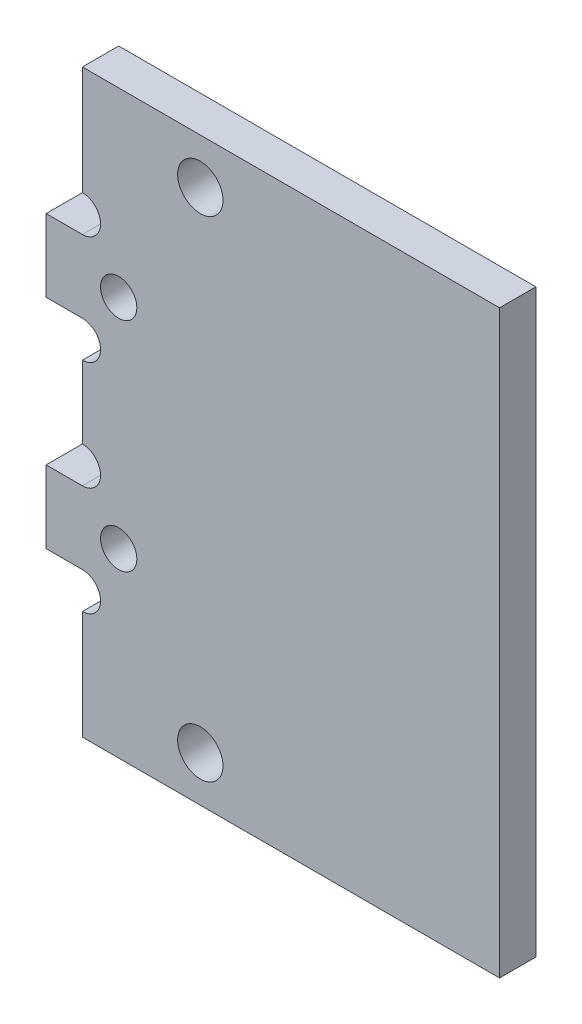
ISO-10303-21;
HEADER;
FILE_DESCRIPTION(('STEP AP214'),'2;1');
FILE_NAME('part.step','',(''),(''),'','','');
FILE_SCHEMA(('AUTOMOTIVE_DESIGN { 1 0 10303 214 1 1 1 1 }'));
ENDSEC;
DATA;
#1=APPLICATION_CONTEXT('core data for automotive mechanical design processes');
#2=APPLICATION_PROTOCOL_DEFINITION('international standard','automotive_design',2000,#1);
#3=PRODUCT_CONTEXT('',#1,'mechanical');
#4=PRODUCT('Part','Part','',(#3));
#5=PRODUCT_RELATED_PRODUCT_CATEGORY('part','',(#4));
#6=PRODUCT_DEFINITION_FORMATION('','',#4);
#7=PRODUCT_DEFINITION_CONTEXT('part definition',#1,'design');
#8=PRODUCT_DEFINITION('design','',#6,#7);
#9=PRODUCT_DEFINITION_SHAPE('','',#8);
#10=(LENGTH_UNIT() NAMED_UNIT(*) SI_UNIT(.MILLI.,.METRE.));
#11=(NAMED_UNIT(*) PLANE_ANGLE_UNIT() SI_UNIT($,.RADIAN.));
#12=(NAMED_UNIT(*) SI_UNIT($,.STERADIAN.) SOLID_ANGLE_UNIT());
#13=UNCERTAINTY_MEASURE_WITH_UNIT(LENGTH_MEASURE(1.E-05),#10,'distance_accuracy_value','');
#14=(GEOMETRIC_REPRESENTATION_CONTEXT(3) GLOBAL_UNCERTAINTY_ASSIGNED_CONTEXT((#13)) GLOBAL_UNIT_ASSIGNED_CONTEXT((#10,
#11,#12)) REPRESENTATION_CONTEXT('',''));
#15=CARTESIAN_POINT('',(0.,0.,0.));
#16=DIRECTION('',(0.,0.,1.));
#17=DIRECTION('',(1.,0.,0.));
#18=AXIS2_PLACEMENT_3D('',#15,#16,#17);
#19=CARTESIAN_POINT('',(-25.7162131979419,3.1625,2.));
#20=DIRECTION('',(0.,0.,1.));
#21=DIRECTION('',(1.,0.,0.));
#22=AXIS2_PLACEMENT_3D('',#19,#20,#21);
#23=PLANE('',#22);
#24=DIRECTION('',(0.,1.,0.));
#25=VECTOR('',#24,1.);
#26=CARTESIAN_POINT('',(-2.71621319794187,5.1625,2.));
#27=LINE('',#26,#25);
#28=CARTESIAN_POINT('',(-2.71621319794187,-21.8375,2.));
#29=VERTEX_POINT('',#28);
#30=CARTESIAN_POINT('',(-2.71621319794187,10.1625,2.));
#31=VERTEX_POINT('',#30);
#32=EDGE_CURVE('E290',#29,#31,#27,.T.);
#33=ORIENTED_EDGE('',*,*,#32,.T.);
#34=DIRECTION('',(-1.,0.,0.));
#35=VECTOR('',#34,1.);
#36=CARTESIAN_POINT('',(-17.2162131979419,10.1625,2.));
#37=LINE('',#36,#35);
#38=CARTESIAN_POINT('',(-25.7162131979419,10.1625,2.));
#39=VERTEX_POINT('',#38);
#40=EDGE_CURVE('E113',#31,#39,#37,.T.);
#41=ORIENTED_EDGE('',*,*,#40,.T.);
#42=DIRECTION('',(0.,-1.,0.));
#43=VECTOR('',#42,1.);
#44=CARTESIAN_POINT('',(-25.7162131979419,10.1625,2.));
#45=LINE('',#44,#43);
#46=CARTESIAN_POINT('',(-25.7162131979419,4.1625,2.));
#47=VERTEX_POINT('',#46);
#48=EDGE_CURVE('E332',#39,#47,#45,.T.);
#49=ORIENTED_EDGE('',*,*,#48,.T.);
#50=CARTESIAN_POINT('',(-25.7162131979419,3.1625,2.));
#51=DIRECTION('',(0.,0.,-1.));
#52=DIRECTION('',(1.,0.,0.));
#53=AXIS2_PLACEMENT_3D('',#50,#51,#52);
#54=CIRCLE('',#53,1.);
#55=CARTESIAN_POINT('',(-25.7162131979419,2.1625,2.));
#56=VERTEX_POINT('',#55);
#57=EDGE_CURVE('E235',#47,#56,#54,.T.);
#58=ORIENTED_EDGE('',*,*,#57,.T.);
#59=DIRECTION('',(-1.,0.,0.));
#60=VECTOR('',#59,1.);
#61=CARTESIAN_POINT('',(-25.7162131979419,2.1625,2.));
#62=LINE('',#61,#60);
#63=CARTESIAN_POINT('',(-27.7162131979419,2.1625,2.));
#64=VERTEX_POINT('',#63);
#65=EDGE_CURVE('E256',#56,#64,#62,.T.);
#66=ORIENTED_EDGE('',*,*,#65,.T.);
#67=DIRECTION('',(0.,-1.,0.));
#68=VECTOR('',#67,1.);
#69=CARTESIAN_POINT('',(-27.7162131979419,2.1625,2.));
#70=LINE('',#69,#68);
#71=CARTESIAN_POINT('',(-27.7162131979419,-1.8375,2.));
#72=VERTEX_POINT('',#71);
#73=EDGE_CURVE('E253',#64,#72,#70,.T.);
#74=ORIENTED_EDGE('',*,*,#73,.T.);
#75=DIRECTION('',(1.,0.,0.));
#76=VECTOR('',#75,1.);
#77=CARTESIAN_POINT('',(-27.7162131979419,-1.8375,2.));
#78=LINE('',#77,#76);
#79=CARTESIAN_POINT('',(-25.7162131979419,-1.8375,2.));
#80=VERTEX_POINT('',#79);
#81=EDGE_CURVE('E255',#72,#80,#78,.T.);
#82=ORIENTED_EDGE('',*,*,#81,.T.);
#83=CARTESIAN_POINT('',(-25.7162131979419,-2.8375,2.));
#84=DIRECTION('',(0.,0.,-1.));
#85=DIRECTION('',(-1.,0.,0.));
#86=AXIS2_PLACEMENT_3D('',#83,#84,#85);
#87=CIRCLE('',#86,1.);
#88=CARTESIAN_POINT('',(-25.7162131979419,-3.8375,2.));
#89=VERTEX_POINT('',#88);
#90=EDGE_CURVE('E258',#80,#89,#87,.T.);
#91=ORIENTED_EDGE('',*,*,#90,.T.);
#92=DIRECTION('',(0.,-1.,0.));
#93=VECTOR('',#92,1.);
#94=CARTESIAN_POINT('',(-25.7162131979419,-3.8375,2.));
#95=LINE('',#94,#93);
#96=CARTESIAN_POINT('',(-25.7162131979419,-7.8375,2.));
#97=VERTEX_POINT('',#96);
#98=EDGE_CURVE('E264',#89,#97,#95,.T.);
#99=ORIENTED_EDGE('',*,*,#98,.T.);
#100=CARTESIAN_POINT('',(-25.7162131979419,-8.8375,2.));
#101=DIRECTION('',(0.,0.,-1.));
#102=DIRECTION('',(1.,0.,0.));
#103=AXIS2_PLACEMENT_3D('',#100,#101,#102);
#104=CIRCLE('',#103,1.);
#105=CARTESIAN_POINT('',(-25.7162131979419,-9.8375,2.));
#106=VERTEX_POINT('',#105);
#107=EDGE_CURVE('E266',#97,#106,#104,.T.);
#108=ORIENTED_EDGE('',*,*,#107,.T.);
#109=DIRECTION('',(-1.,0.,0.));
#110=VECTOR('',#109,1.);
#111=CARTESIAN_POINT('',(-27.7162131979419,-9.8375,2.));
#112=LINE('',#111,#110);
#113=CARTESIAN_POINT('',(-27.7162131979419,-9.8375,2.));
#114=VERTEX_POINT('',#113);
#115=EDGE_CURVE('E268',#106,#114,#112,.T.);
#116=ORIENTED_EDGE('',*,*,#115,.T.);
#117=DIRECTION('',(0.,-1.,0.));
#118=VECTOR('',#117,1.);
#119=CARTESIAN_POINT('',(-27.7162131979419,-13.8375,2.));
#120=LINE('',#119,#118);
#121=CARTESIAN_POINT('',(-27.7162131979419,-13.8375,2.));
#122=VERTEX_POINT('',#121);
#123=EDGE_CURVE('E153',#114,#122,#120,.T.);
#124=ORIENTED_EDGE('',*,*,#123,.T.);
#125=DIRECTION('',(1.,0.,0.));
#126=VECTOR('',#125,1.);
#127=CARTESIAN_POINT('',(-25.7162131979419,-13.8375,2.));
#128=LINE('',#127,#126);
#129=CARTESIAN_POINT('',(-25.7162131979419,-13.8375,2.));
#130=VERTEX_POINT('',#129);
#131=EDGE_CURVE('E147',#122,#130,#128,.T.);
#132=ORIENTED_EDGE('',*,*,#131,.T.);
#133=CARTESIAN_POINT('',(-25.7162131979419,-14.8375,2.));
#134=DIRECTION('',(0.,0.,-1.));
#135=DIRECTION('',(-1.,0.,0.));
#136=AXIS2_PLACEMENT_3D('',#133,#134,#135);
#137=CIRCLE('',#136,0.999999999999999);
#138=CARTESIAN_POINT('',(-25.7162131979419,-15.8375,2.));
#139=VERTEX_POINT('',#138);
#140=EDGE_CURVE('E151',#130,#139,#137,.T.);
#141=ORIENTED_EDGE('',*,*,#140,.T.);
#142=DIRECTION('',(0.,-1.,0.));
#143=VECTOR('',#142,1.);
#144=CARTESIAN_POINT('',(-25.7162131979419,-15.8375,2.));
#145=LINE('',#144,#143);
#146=CARTESIAN_POINT('',(-25.7162131979419,-21.8375,2.));
#147=VERTEX_POINT('',#146);
#148=EDGE_CURVE('E49',#139,#147,#145,.T.);
#149=ORIENTED_EDGE('',*,*,#148,.T.);
#150=DIRECTION('',(1.,0.,0.));
#151=VECTOR('',#150,1.);
#152=CARTESIAN_POINT('',(-19.7162131979419,-21.8375,2.));
#153=LINE('',#152,#151);
#154=EDGE_CURVE('E167',#147,#29,#153,.T.);
#155=ORIENTED_EDGE('',*,*,#154,.T.);
#156=EDGE_LOOP('',(#33,#41,#49,#58,#66,#74,#82,#91,#99,#108,#116,#124,#132,#141,#149,#155));
#157=FACE_BOUND('',#156,.T.);
#158=CARTESIAN_POINT('',(-23.7162131979419,0.162500000000001,2.));
#159=DIRECTION('',(0.,0.,1.));
#160=DIRECTION('',(1.,0.,0.));
#161=AXIS2_PLACEMENT_3D('',#158,#159,#160);
#162=CIRCLE('',#161,1.);
#163=CARTESIAN_POINT('',(-22.7162131979419,0.162500000000001,2.));
#164=VERTEX_POINT('',#163);
#165=EDGE_CURVE('E315',#164,#164,#162,.T.);
#166=ORIENTED_EDGE('',*,*,#165,.F.);
#167=EDGE_LOOP('',(#166));
#168=FACE_BOUND('',#167,.T.);
#169=CARTESIAN_POINT('',(-19.2162131979419,7.6625,2.));
#170=DIRECTION('',(0.,0.,1.));
#171=DIRECTION('',(1.,0.,0.));
#172=AXIS2_PLACEMENT_3D('',#169,#170,#171);
#173=CIRCLE('',#172,1.25);
#174=CARTESIAN_POINT('',(-17.9662131979419,7.6625,2.));
#175=VERTEX_POINT('',#174);
#176=EDGE_CURVE('E176',#175,#175,#173,.T.);
#177=ORIENTED_EDGE('',*,*,#176,.F.);
#178=EDGE_LOOP('',(#177));
#179=FACE_BOUND('',#178,.T.);
#180=CARTESIAN_POINT('',(-19.2162131979419,-19.3375,2.));
#181=DIRECTION('',(0.,0.,1.));
#182=DIRECTION('',(1.,0.,0.));
#183=AXIS2_PLACEMENT_3D('',#180,#181,#182);
#184=CIRCLE('',#183,1.25);
#185=CARTESIAN_POINT('',(-17.9662131979419,-19.3375,2.));
#186=VERTEX_POINT('',#185);
#187=EDGE_CURVE('E321',#186,#186,#184,.T.);
#188=ORIENTED_EDGE('',*,*,#187,.F.);
#189=EDGE_LOOP('',(#188));
#190=FACE_BOUND('',#189,.T.);
#191=CARTESIAN_POINT('',(-23.7162131979419,-11.8375,2.));
#192=DIRECTION('',(0.,0.,1.));
#193=DIRECTION('',(1.,0.,0.));
#194=AXIS2_PLACEMENT_3D('',#191,#192,#193);
#195=CIRCLE('',#194,1.);
#196=CARTESIAN_POINT('',(-22.7162131979419,-11.8375,2.));
#197=VERTEX_POINT('',#196);
#198=EDGE_CURVE('E309',#197,#197,#195,.T.);
#199=ORIENTED_EDGE('',*,*,#198,.F.);
#200=EDGE_LOOP('',(#199));
#201=FACE_BOUND('',#200,.T.);
#202=ADVANCED_FACE('F32',(#157,#168,#179,#190,#201),#23,.T.);
#203=CARTESIAN_POINT('',(-25.7162131979419,3.1625,0.));
#204=DIRECTION('',(0.,0.,1.));
#205=DIRECTION('',(1.,0.,0.));
#206=AXIS2_PLACEMENT_3D('',#203,#204,#205);
#207=PLANE('',#206);
#208=DIRECTION('',(-1.,0.,0.));
#209=VECTOR('',#208,1.);
#210=CARTESIAN_POINT('',(-17.2162131979419,10.1625,0.));
#211=LINE('',#210,#209);
#212=CARTESIAN_POINT('',(-2.71621319794187,10.1625,0.));
#213=VERTEX_POINT('',#212);
#214=CARTESIAN_POINT('',(-25.7162131979419,10.1625,0.));
#215=VERTEX_POINT('',#214);
#216=EDGE_CURVE('E199',#213,#215,#211,.T.);
#217=ORIENTED_EDGE('',*,*,#216,.F.);
#218=DIRECTION('',(0.,1.,0.));
#219=VECTOR('',#218,1.);
#220=CARTESIAN_POINT('',(-2.71621319794187,5.1625,0.));
#221=LINE('',#220,#219);
#222=CARTESIAN_POINT('',(-2.71621319794187,-21.8375,0.));
#223=VERTEX_POINT('',#222);
#224=EDGE_CURVE('E297',#223,#213,#221,.T.);
#225=ORIENTED_EDGE('',*,*,#224,.F.);
#226=DIRECTION('',(1.,0.,0.));
#227=VECTOR('',#226,1.);
#228=CARTESIAN_POINT('',(13.2837868020581,-21.8375,0.));
#229=LINE('',#228,#227);
#230=CARTESIAN_POINT('',(-25.7162131979419,-21.8375,0.));
#231=VERTEX_POINT('',#230);
#232=EDGE_CURVE('E105',#231,#223,#229,.T.);
#233=ORIENTED_EDGE('',*,*,#232,.F.);
#234=DIRECTION('',(0.,-1.,0.));
#235=VECTOR('',#234,1.);
#236=CARTESIAN_POINT('',(-25.7162131979419,-15.8375,0.));
#237=LINE('',#236,#235);
#238=CARTESIAN_POINT('',(-25.7162131979419,-15.8375,0.));
#239=VERTEX_POINT('',#238);
#240=EDGE_CURVE('E196',#239,#231,#237,.T.);
#241=ORIENTED_EDGE('',*,*,#240,.F.);
#242=CARTESIAN_POINT('',(-25.7162131979419,-14.8375,0.));
#243=DIRECTION('',(0.,0.,-1.));
#244=DIRECTION('',(-1.,0.,0.));
#245=AXIS2_PLACEMENT_3D('',#242,#243,#244);
#246=CIRCLE('',#245,0.999999999999999);
#247=CARTESIAN_POINT('',(-25.7162131979419,-13.8375,0.));
#248=VERTEX_POINT('',#247);
#249=EDGE_CURVE('E97',#248,#239,#246,.T.);
#250=ORIENTED_EDGE('',*,*,#249,.F.);
#251=DIRECTION('',(1.,0.,0.));
#252=VECTOR('',#251,1.);
#253=CARTESIAN_POINT('',(-25.7162131979419,-13.8375,0.));
#254=LINE('',#253,#252);
#255=CARTESIAN_POINT('',(-27.7162131979419,-13.8375,0.));
#256=VERTEX_POINT('',#255);
#257=EDGE_CURVE('E161',#256,#248,#254,.T.);
#258=ORIENTED_EDGE('',*,*,#257,.F.);
#259=DIRECTION('',(0.,-1.,0.));
#260=VECTOR('',#259,1.);
#261=CARTESIAN_POINT('',(-27.7162131979419,-13.8375,0.));
#262=LINE('',#261,#260);
#263=CARTESIAN_POINT('',(-27.7162131979419,-9.8375,0.));
#264=VERTEX_POINT('',#263);
#265=EDGE_CURVE('E192',#264,#256,#262,.T.);
#266=ORIENTED_EDGE('',*,*,#265,.F.);
#267=DIRECTION('',(-1.,0.,0.));
#268=VECTOR('',#267,1.);
#269=CARTESIAN_POINT('',(-27.7162131979419,-9.8375,0.));
#270=LINE('',#269,#268);
#271=CARTESIAN_POINT('',(-25.7162131979419,-9.8375,0.));
#272=VERTEX_POINT('',#271);
#273=EDGE_CURVE('E190',#272,#264,#270,.T.);
#274=ORIENTED_EDGE('',*,*,#273,.F.);
#275=CARTESIAN_POINT('',(-25.7162131979419,-8.8375,0.));
#276=DIRECTION('',(0.,0.,-1.));
#277=DIRECTION('',(1.,0.,0.));
#278=AXIS2_PLACEMENT_3D('',#275,#276,#277);
#279=CIRCLE('',#278,1.);
#280=CARTESIAN_POINT('',(-25.7162131979419,-7.8375,0.));
#281=VERTEX_POINT('',#280);
#282=EDGE_CURVE('E188',#281,#272,#279,.T.);
#283=ORIENTED_EDGE('',*,*,#282,.F.);
#284=DIRECTION('',(0.,-1.,0.));
#285=VECTOR('',#284,1.);
#286=CARTESIAN_POINT('',(-25.7162131979419,-3.8375,0.));
#287=LINE('',#286,#285);
#288=CARTESIAN_POINT('',(-25.7162131979419,-3.8375,0.));
#289=VERTEX_POINT('',#288);
#290=EDGE_CURVE('E186',#289,#281,#287,.T.);
#291=ORIENTED_EDGE('',*,*,#290,.F.);
#292=CARTESIAN_POINT('',(-25.7162131979419,-2.8375,0.));
#293=DIRECTION('',(0.,0.,-1.));
#294=DIRECTION('',(-1.,0.,0.));
#295=AXIS2_PLACEMENT_3D('',#292,#293,#294);
#296=CIRCLE('',#295,1.);
#297=CARTESIAN_POINT('',(-25.7162131979419,-1.8375,0.));
#298=VERTEX_POINT('',#297);
#299=EDGE_CURVE('E184',#298,#289,#296,.T.);
#300=ORIENTED_EDGE('',*,*,#299,.F.);
#301=DIRECTION('',(1.,0.,0.));
#302=VECTOR('',#301,1.);
#303=CARTESIAN_POINT('',(-27.7162131979419,-1.8375,0.));
#304=LINE('',#303,#302);
#305=CARTESIAN_POINT('',(-27.7162131979419,-1.8375,0.));
#306=VERTEX_POINT('',#305);
#307=EDGE_CURVE('E182',#306,#298,#304,.T.);
#308=ORIENTED_EDGE('',*,*,#307,.F.);
#309=DIRECTION('',(0.,-1.,0.));
#310=VECTOR('',#309,1.);
#311=CARTESIAN_POINT('',(-27.7162131979419,2.1625,0.));
#312=LINE('',#311,#310);
#313=CARTESIAN_POINT('',(-27.7162131979419,2.1625,0.));
#314=VERTEX_POINT('',#313);
#315=EDGE_CURVE('E180',#314,#306,#312,.T.);
#316=ORIENTED_EDGE('',*,*,#315,.F.);
#317=DIRECTION('',(-1.,0.,0.));
#318=VECTOR('',#317,1.);
#319=CARTESIAN_POINT('',(-25.7162131979419,2.1625,0.));
#320=LINE('',#319,#318);
#321=CARTESIAN_POINT('',(-25.7162131979419,2.1625,0.));
#322=VERTEX_POINT('',#321);
#323=EDGE_CURVE('E178',#322,#314,#320,.T.);
#324=ORIENTED_EDGE('',*,*,#323,.F.);
#325=CARTESIAN_POINT('',(-25.7162131979419,3.1625,0.));
#326=DIRECTION('',(0.,0.,-1.));
#327=DIRECTION('',(1.,0.,0.));
#328=AXIS2_PLACEMENT_3D('',#325,#326,#327);
#329=CIRCLE('',#328,1.);
#330=CARTESIAN_POINT('',(-25.7162131979419,4.1625,0.));
#331=VERTEX_POINT('',#330);
#332=EDGE_CURVE('E175',#331,#322,#329,.T.);
#333=ORIENTED_EDGE('',*,*,#332,.F.);
#334=DIRECTION('',(0.,-1.,0.));
#335=VECTOR('',#334,1.);
#336=CARTESIAN_POINT('',(-25.7162131979419,10.1625,0.));
#337=LINE('',#336,#335);
#338=EDGE_CURVE('E173',#215,#331,#337,.T.);
#339=ORIENTED_EDGE('',*,*,#338,.F.);
#340=EDGE_LOOP('',(#217,#225,#233,#241,#250,#258,#266,#274,#283,#291,#300,#308,#316,#324,#333,#339));
#341=FACE_BOUND('',#340,.T.);
#342=CARTESIAN_POINT('',(-19.2162131979419,7.6625,0.));
#343=DIRECTION('',(0.,0.,1.));
#344=DIRECTION('',(1.,0.,0.));
#345=AXIS2_PLACEMENT_3D('',#342,#343,#344);
#346=CIRCLE('',#345,1.25);
#347=CARTESIAN_POINT('',(-17.9662131979419,7.6625,0.));
#348=VERTEX_POINT('',#347);
#349=EDGE_CURVE('E324',#348,#348,#346,.T.);
#350=ORIENTED_EDGE('',*,*,#349,.T.);
#351=EDGE_LOOP('',(#350));
#352=FACE_BOUND('',#351,.T.);
#353=CARTESIAN_POINT('',(-19.2162131979419,-19.3375,0.));
#354=DIRECTION('',(0.,0.,1.));
#355=DIRECTION('',(1.,0.,0.));
#356=AXIS2_PLACEMENT_3D('',#353,#354,#355);
#357=CIRCLE('',#356,1.25);
#358=CARTESIAN_POINT('',(-17.9662131979419,-19.3375,0.));
#359=VERTEX_POINT('',#358);
#360=EDGE_CURVE('E318',#359,#359,#357,.T.);
#361=ORIENTED_EDGE('',*,*,#360,.T.);
#362=EDGE_LOOP('',(#361));
#363=FACE_BOUND('',#362,.T.);
#364=CARTESIAN_POINT('',(-23.7162131979419,0.162500000000001,0.));
#365=DIRECTION('',(0.,0.,1.));
#366=DIRECTION('',(1.,0.,0.));
#367=AXIS2_PLACEMENT_3D('',#364,#365,#366);
#368=CIRCLE('',#367,1.);
#369=CARTESIAN_POINT('',(-22.7162131979419,0.162500000000001,0.));
#370=VERTEX_POINT('',#369);
#371=EDGE_CURVE('E312',#370,#370,#368,.T.);
#372=ORIENTED_EDGE('',*,*,#371,.T.);
#373=EDGE_LOOP('',(#372));
#374=FACE_BOUND('',#373,.T.);
#375=CARTESIAN_POINT('',(-23.7162131979419,-11.8375,0.));
#376=DIRECTION('',(0.,0.,1.));
#377=DIRECTION('',(1.,0.,0.));
#378=AXIS2_PLACEMENT_3D('',#375,#376,#377);
#379=CIRCLE('',#378,1.);
#380=CARTESIAN_POINT('',(-22.7162131979419,-11.8375,0.));
#381=VERTEX_POINT('',#380);
#382=EDGE_CURVE('E307',#381,#381,#379,.T.);
#383=ORIENTED_EDGE('',*,*,#382,.T.);
#384=EDGE_LOOP('',(#383));
#385=FACE_BOUND('',#384,.T.);
#386=ADVANCED_FACE('F241',(#341,#352,#363,#374,#385),#207,.F.);
#387=CARTESIAN_POINT('',(-25.7162131979419,10.1625,2.));
#388=DIRECTION('',(1.,0.,0.));
#389=DIRECTION('',(0.,0.,-1.));
#390=AXIS2_PLACEMENT_3D('',#387,#388,#389);
#391=PLANE('',#390);
#392=ORIENTED_EDGE('',*,*,#338,.T.);
#393=DIRECTION('',(0.,0.,-1.));
#394=VECTOR('',#393,1.);
#395=CARTESIAN_POINT('',(-25.7162131979419,4.1625,2.));
#396=LINE('',#395,#394);
#397=EDGE_CURVE('E41',#47,#331,#396,.T.);
#398=ORIENTED_EDGE('',*,*,#397,.F.);
#399=ORIENTED_EDGE('',*,*,#48,.F.);
#400=DIRECTION('',(0.,0.,-1.));
#401=VECTOR('',#400,1.);
#402=CARTESIAN_POINT('',(-25.7162131979419,10.1625,2.));
#403=LINE('',#402,#401);
#404=EDGE_CURVE('E11',#39,#215,#403,.T.);
#405=ORIENTED_EDGE('',*,*,#404,.T.);
#406=EDGE_LOOP('',(#392,#398,#399,#405));
#407=FACE_BOUND('',#406,.T.);
#408=ADVANCED_FACE('F34',(#407),#391,.F.);
#409=CARTESIAN_POINT('',(-25.7162131979419,3.1625,2.));
#410=DIRECTION('',(0.,0.,-1.));
#411=DIRECTION('',(-1.,0.,0.));
#412=AXIS2_PLACEMENT_3D('',#409,#410,#411);
#413=CYLINDRICAL_SURFACE('',#412,1.);
#414=ORIENTED_EDGE('',*,*,#332,.T.);
#415=DIRECTION('',(0.,0.,-1.));
#416=VECTOR('',#415,1.);
#417=CARTESIAN_POINT('',(-25.7162131979419,2.1625,2.));
#418=LINE('',#417,#416);
#419=EDGE_CURVE('E226',#56,#322,#418,.T.);
#420=ORIENTED_EDGE('',*,*,#419,.F.);
#421=ORIENTED_EDGE('',*,*,#57,.F.);
#422=ORIENTED_EDGE('',*,*,#397,.T.);
#423=EDGE_LOOP('',(#414,#420,#421,#422));
#424=FACE_BOUND('',#423,.T.);
#425=ADVANCED_FACE('F233',(#424),#413,.F.);
#426=CARTESIAN_POINT('',(-25.7162131979419,2.1625,2.));
#427=DIRECTION('',(0.,-1.,0.));
#428=DIRECTION('',(1.,0.,0.));
#429=AXIS2_PLACEMENT_3D('',#426,#427,#428);
#430=PLANE('',#429);
#431=ORIENTED_EDGE('',*,*,#323,.T.);
#432=DIRECTION('',(0.,0.,-1.));
#433=VECTOR('',#432,1.);
#434=CARTESIAN_POINT('',(-27.7162131979419,2.1625,2.));
#435=LINE('',#434,#433);
#436=EDGE_CURVE('E223',#64,#314,#435,.T.);
#437=ORIENTED_EDGE('',*,*,#436,.F.);
#438=ORIENTED_EDGE('',*,*,#65,.F.);
#439=ORIENTED_EDGE('',*,*,#419,.T.);
#440=EDGE_LOOP('',(#431,#437,#438,#439));
#441=FACE_BOUND('',#440,.T.);
#442=ADVANCED_FACE('F247',(#441),#430,.F.);
#443=CARTESIAN_POINT('',(-27.7162131979419,2.1625,2.));
#444=DIRECTION('',(1.,0.,0.));
#445=DIRECTION('',(0.,0.,-1.));
#446=AXIS2_PLACEMENT_3D('',#443,#444,#445);
#447=PLANE('',#446);
#448=ORIENTED_EDGE('',*,*,#315,.T.);
#449=DIRECTION('',(0.,0.,-1.));
#450=VECTOR('',#449,1.);
#451=CARTESIAN_POINT('',(-27.7162131979419,-1.8375,2.));
#452=LINE('',#451,#450);
#453=EDGE_CURVE('E220',#72,#306,#452,.T.);
#454=ORIENTED_EDGE('',*,*,#453,.F.);
#455=ORIENTED_EDGE('',*,*,#73,.F.);
#456=ORIENTED_EDGE('',*,*,#436,.T.);
#457=EDGE_LOOP('',(#448,#454,#455,#456));
#458=FACE_BOUND('',#457,.T.);
#459=ADVANCED_FACE('F251',(#458),#447,.F.);
#460=CARTESIAN_POINT('',(-27.7162131979419,-1.8375,2.));
#461=DIRECTION('',(0.,1.,0.));
#462=DIRECTION('',(-1.,0.,0.));
#463=AXIS2_PLACEMENT_3D('',#460,#461,#462);
#464=PLANE('',#463);
#465=ORIENTED_EDGE('',*,*,#307,.T.);
#466=DIRECTION('',(0.,0.,-1.));
#467=VECTOR('',#466,1.);
#468=CARTESIAN_POINT('',(-25.7162131979419,-1.8375,2.));
#469=LINE('',#468,#467);
#470=EDGE_CURVE('E217',#80,#298,#469,.T.);
#471=ORIENTED_EDGE('',*,*,#470,.F.);
#472=ORIENTED_EDGE('',*,*,#81,.F.);
#473=ORIENTED_EDGE('',*,*,#453,.T.);
#474=EDGE_LOOP('',(#465,#471,#472,#473));
#475=FACE_BOUND('',#474,.T.);
#476=ADVANCED_FACE('F372',(#475),#464,.F.);
#477=CARTESIAN_POINT('',(-25.7162131979419,-2.8375,2.));
#478=DIRECTION('',(0.,0.,-1.));
#479=DIRECTION('',(-1.,0.,0.));
#480=AXIS2_PLACEMENT_3D('',#477,#478,#479);
#481=CYLINDRICAL_SURFACE('',#480,1.);
#482=ORIENTED_EDGE('',*,*,#299,.T.);
#483=DIRECTION('',(0.,0.,-1.));
#484=VECTOR('',#483,1.);
#485=CARTESIAN_POINT('',(-25.7162131979419,-3.8375,2.));
#486=LINE('',#485,#484);
#487=EDGE_CURVE('E214',#89,#289,#486,.T.);
#488=ORIENTED_EDGE('',*,*,#487,.F.);
#489=ORIENTED_EDGE('',*,*,#90,.F.);
#490=ORIENTED_EDGE('',*,*,#470,.T.);
#491=EDGE_LOOP('',(#482,#488,#489,#490));
#492=FACE_BOUND('',#491,.T.);
#493=ADVANCED_FACE('F368',(#492),#481,.F.);
#494=CARTESIAN_POINT('',(-25.7162131979419,-3.8375,2.));
#495=DIRECTION('',(1.,0.,0.));
#496=DIRECTION('',(0.,0.,-1.));
#497=AXIS2_PLACEMENT_3D('',#494,#495,#496);
#498=PLANE('',#497);
#499=ORIENTED_EDGE('',*,*,#290,.T.);
#500=DIRECTION('',(0.,0.,-1.));
#501=VECTOR('',#500,1.);
#502=CARTESIAN_POINT('',(-25.7162131979419,-7.8375,2.));
#503=LINE('',#502,#501);
#504=EDGE_CURVE('E211',#97,#281,#503,.T.);
#505=ORIENTED_EDGE('',*,*,#504,.F.);
#506=ORIENTED_EDGE('',*,*,#98,.F.);
#507=ORIENTED_EDGE('',*,*,#487,.T.);
#508=EDGE_LOOP('',(#499,#505,#506,#507));
#509=FACE_BOUND('',#508,.T.);
#510=ADVANCED_FACE('F364',(#509),#498,.F.);
#511=CARTESIAN_POINT('',(-25.7162131979419,-8.8375,2.));
#512=DIRECTION('',(0.,0.,-1.));
#513=DIRECTION('',(-1.,0.,0.));
#514=AXIS2_PLACEMENT_3D('',#511,#512,#513);
#515=CYLINDRICAL_SURFACE('',#514,1.);
#516=ORIENTED_EDGE('',*,*,#282,.T.);
#517=DIRECTION('',(0.,0.,-1.));
#518=VECTOR('',#517,1.);
#519=CARTESIAN_POINT('',(-25.7162131979419,-9.8375,2.));
#520=LINE('',#519,#518);
#521=EDGE_CURVE('E208',#106,#272,#520,.T.);
#522=ORIENTED_EDGE('',*,*,#521,.F.);
#523=ORIENTED_EDGE('',*,*,#107,.F.);
#524=ORIENTED_EDGE('',*,*,#504,.T.);
#525=EDGE_LOOP('',(#516,#522,#523,#524));
#526=FACE_BOUND('',#525,.T.);
#527=ADVANCED_FACE('F361',(#526),#515,.F.);
#528=CARTESIAN_POINT('',(-27.7162131979419,-9.8375,2.));
#529=DIRECTION('',(0.,-1.,0.));
#530=DIRECTION('',(0.,0.,-1.));
#531=AXIS2_PLACEMENT_3D('',#528,#529,#530);
#532=PLANE('',#531);
#533=ORIENTED_EDGE('',*,*,#273,.T.);
#534=DIRECTION('',(0.,0.,-1.));
#535=VECTOR('',#534,1.);
#536=CARTESIAN_POINT('',(-27.7162131979419,-9.8375,2.));
#537=LINE('',#536,#535);
#538=EDGE_CURVE('E205',#114,#264,#537,.T.);
#539=ORIENTED_EDGE('',*,*,#538,.F.);
#540=ORIENTED_EDGE('',*,*,#115,.F.);
#541=ORIENTED_EDGE('',*,*,#521,.T.);
#542=EDGE_LOOP('',(#533,#539,#540,#541));
#543=FACE_BOUND('',#542,.T.);
#544=ADVANCED_FACE('F274',(#543),#532,.F.);
#545=CARTESIAN_POINT('',(-27.7162131979419,-13.8375,2.));
#546=DIRECTION('',(1.,0.,0.));
#547=DIRECTION('',(0.,0.,-1.));
#548=AXIS2_PLACEMENT_3D('',#545,#546,#547);
#549=PLANE('',#548);
#550=ORIENTED_EDGE('',*,*,#265,.T.);
#551=DIRECTION('',(0.,0.,-1.));
#552=VECTOR('',#551,1.);
#553=CARTESIAN_POINT('',(-27.7162131979419,-13.8375,2.));
#554=LINE('',#553,#552);
#555=EDGE_CURVE('E162',#122,#256,#554,.T.);
#556=ORIENTED_EDGE('',*,*,#555,.F.);
#557=ORIENTED_EDGE('',*,*,#123,.F.);
#558=ORIENTED_EDGE('',*,*,#538,.T.);
#559=EDGE_LOOP('',(#550,#556,#557,#558));
#560=FACE_BOUND('',#559,.T.);
#561=ADVANCED_FACE('F278',(#560),#549,.F.);
#562=CARTESIAN_POINT('',(-25.7162131979419,-13.8375,2.));
#563=DIRECTION('',(0.,1.,0.));
#564=DIRECTION('',(0.,0.,1.));
#565=AXIS2_PLACEMENT_3D('',#562,#563,#564);
#566=PLANE('',#565);
#567=ORIENTED_EDGE('',*,*,#257,.T.);
#568=DIRECTION('',(0.,0.,-1.));
#569=VECTOR('',#568,1.);
#570=CARTESIAN_POINT('',(-25.7162131979419,-13.8375,2.));
#571=LINE('',#570,#569);
#572=EDGE_CURVE('E158',#130,#248,#571,.T.);
#573=ORIENTED_EDGE('',*,*,#572,.F.);
#574=ORIENTED_EDGE('',*,*,#131,.F.);
#575=ORIENTED_EDGE('',*,*,#555,.T.);
#576=EDGE_LOOP('',(#567,#573,#574,#575));
#577=FACE_BOUND('',#576,.T.);
#578=ADVANCED_FACE('F159',(#577),#566,.F.);
#579=CARTESIAN_POINT('',(-25.7162131979419,-14.8375,2.));
#580=DIRECTION('',(0.,0.,-1.));
#581=DIRECTION('',(-1.,0.,0.));
#582=AXIS2_PLACEMENT_3D('',#579,#580,#581);
#583=CYLINDRICAL_SURFACE('',#582,0.999999999999999);
#584=ORIENTED_EDGE('',*,*,#249,.T.);
#585=DIRECTION('',(0.,0.,-1.));
#586=VECTOR('',#585,1.);
#587=CARTESIAN_POINT('',(-25.7162131979419,-15.8375,2.));
#588=LINE('',#587,#586);
#589=EDGE_CURVE('E163',#139,#239,#588,.T.);
#590=ORIENTED_EDGE('',*,*,#589,.F.);
#591=ORIENTED_EDGE('',*,*,#140,.F.);
#592=ORIENTED_EDGE('',*,*,#572,.T.);
#593=EDGE_LOOP('',(#584,#590,#591,#592));
#594=FACE_BOUND('',#593,.T.);
#595=ADVANCED_FACE('F165',(#594),#583,.F.);
#596=CARTESIAN_POINT('',(-25.7162131979419,-15.8375,2.));
#597=DIRECTION('',(1.,0.,0.));
#598=DIRECTION('',(0.,1.,0.));
#599=AXIS2_PLACEMENT_3D('',#596,#597,#598);
#600=PLANE('',#599);
#601=ORIENTED_EDGE('',*,*,#240,.T.);
#602=DIRECTION('',(0.,0.,-1.));
#603=VECTOR('',#602,1.);
#604=CARTESIAN_POINT('',(-25.7162131979419,-21.8375,2.));
#605=LINE('',#604,#603);
#606=EDGE_CURVE('E172',#147,#231,#605,.T.);
#607=ORIENTED_EDGE('',*,*,#606,.F.);
#608=ORIENTED_EDGE('',*,*,#148,.F.);
#609=ORIENTED_EDGE('',*,*,#589,.T.);
#610=EDGE_LOOP('',(#601,#607,#608,#609));
#611=FACE_BOUND('',#610,.T.);
#612=ADVANCED_FACE('F280',(#611),#600,.F.);
#613=CARTESIAN_POINT('',(13.2837868020581,-21.8375,2.));
#614=DIRECTION('',(0.,1.,0.));
#615=DIRECTION('',(-1.,0.,0.));
#616=AXIS2_PLACEMENT_3D('',#613,#614,#615);
#617=PLANE('',#616);
#618=ORIENTED_EDGE('',*,*,#232,.T.);
#619=DIRECTION('',(0.,0.,-1.));
#620=VECTOR('',#619,1.);
#621=CARTESIAN_POINT('',(-2.71621319794187,-21.8375,10.));
#622=LINE('',#621,#620);
#623=EDGE_CURVE('E288',#29,#223,#622,.T.);
#624=ORIENTED_EDGE('',*,*,#623,.F.);
#625=ORIENTED_EDGE('',*,*,#154,.F.);
#626=ORIENTED_EDGE('',*,*,#606,.T.);
#627=EDGE_LOOP('',(#618,#624,#625,#626));
#628=FACE_BOUND('',#627,.T.);
#629=ADVANCED_FACE('F283',(#628),#617,.F.);
#630=CARTESIAN_POINT('',(-17.2162131979419,10.1625,2.));
#631=DIRECTION('',(0.,-1.,0.));
#632=DIRECTION('',(0.,0.,-1.));
#633=AXIS2_PLACEMENT_3D('',#630,#631,#632);
#634=PLANE('',#633);
#635=ORIENTED_EDGE('',*,*,#40,.F.);
#636=DIRECTION('',(0.,0.,-1.));
#637=VECTOR('',#636,1.);
#638=CARTESIAN_POINT('',(-2.71621319794187,10.1625,10.));
#639=LINE('',#638,#637);
#640=EDGE_CURVE('E300',#31,#213,#639,.T.);
#641=ORIENTED_EDGE('',*,*,#640,.T.);
#642=ORIENTED_EDGE('',*,*,#216,.T.);
#643=ORIENTED_EDGE('',*,*,#404,.F.);
#644=EDGE_LOOP('',(#635,#641,#642,#643));
#645=FACE_BOUND('',#644,.T.);
#646=ADVANCED_FACE('F303',(#645),#634,.F.);
#647=CARTESIAN_POINT('',(-19.2162131979419,7.6625,2.));
#648=DIRECTION('',(0.,0.,-1.));
#649=DIRECTION('',(-1.,0.,0.));
#650=AXIS2_PLACEMENT_3D('',#647,#648,#649);
#651=CYLINDRICAL_SURFACE('',#650,1.25);
#652=ORIENTED_EDGE('',*,*,#176,.T.);
#653=EDGE_LOOP('',(#652));
#654=FACE_BOUND('',#653,.T.);
#655=ORIENTED_EDGE('',*,*,#349,.F.);
#656=EDGE_LOOP('',(#655));
#657=FACE_BOUND('',#656,.T.);
#658=ADVANCED_FACE('F344',(#654,#657),#651,.F.);
#659=CARTESIAN_POINT('',(-19.2162131979419,-19.3375,2.));
#660=DIRECTION('',(0.,0.,-1.));
#661=DIRECTION('',(-1.,0.,0.));
#662=AXIS2_PLACEMENT_3D('',#659,#660,#661);
#663=CYLINDRICAL_SURFACE('',#662,1.25);
#664=ORIENTED_EDGE('',*,*,#187,.T.);
#665=EDGE_LOOP('',(#664));
#666=FACE_BOUND('',#665,.T.);
#667=ORIENTED_EDGE('',*,*,#360,.F.);
#668=EDGE_LOOP('',(#667));
#669=FACE_BOUND('',#668,.T.);
#670=ADVANCED_FACE('F440',(#666,#669),#663,.F.);
#671=CARTESIAN_POINT('',(-23.7162131979419,0.162500000000001,2.));
#672=DIRECTION('',(0.,0.,-1.));
#673=DIRECTION('',(-1.,0.,0.));
#674=AXIS2_PLACEMENT_3D('',#671,#672,#673);
#675=CYLINDRICAL_SURFACE('',#674,1.);
#676=ORIENTED_EDGE('',*,*,#165,.T.);
#677=EDGE_LOOP('',(#676));
#678=FACE_BOUND('',#677,.T.);
#679=ORIENTED_EDGE('',*,*,#371,.F.);
#680=EDGE_LOOP('',(#679));
#681=FACE_BOUND('',#680,.T.);
#682=ADVANCED_FACE('F447',(#678,#681),#675,.F.);
#683=CARTESIAN_POINT('',(-23.7162131979419,-11.8375,2.));
#684=DIRECTION('',(0.,0.,-1.));
#685=DIRECTION('',(-1.,0.,0.));
#686=AXIS2_PLACEMENT_3D('',#683,#684,#685);
#687=CYLINDRICAL_SURFACE('',#686,1.);
#688=ORIENTED_EDGE('',*,*,#198,.T.);
#689=EDGE_LOOP('',(#688));
#690=FACE_BOUND('',#689,.T.);
#691=ORIENTED_EDGE('',*,*,#382,.F.);
#692=EDGE_LOOP('',(#691));
#693=FACE_BOUND('',#692,.T.);
#694=ADVANCED_FACE('F454',(#690,#693),#687,.F.);
#695=CARTESIAN_POINT('',(-2.71621319794187,5.1625,2.));
#696=DIRECTION('',(-1.,0.,0.));
#697=DIRECTION('',(0.,-1.,0.));
#698=AXIS2_PLACEMENT_3D('',#695,#696,#697);
#699=PLANE('',#698);
#700=ORIENTED_EDGE('',*,*,#32,.F.);
#701=ORIENTED_EDGE('',*,*,#623,.T.);
#702=ORIENTED_EDGE('',*,*,#224,.T.);
#703=ORIENTED_EDGE('',*,*,#640,.F.);
#704=EDGE_LOOP('',(#700,#701,#702,#703));
#705=FACE_BOUND('',#704,.T.);
#706=ADVANCED_FACE('F299',(#705),#699,.F.);
#707=CLOSED_SHELL('',(#202,#386,#408,#425,#442,#459,#476,#493,#510,#527,#544,#561,#578,#595,
#612,#629,#646,#658,#670,#682,#694,#706));
#708=MANIFOLD_SOLID_BREP('B2',#707);
#709=ADVANCED_BREP_SHAPE_REPRESENTATION('',(#18,#708),#14);
#710=SHAPE_DEFINITION_REPRESENTATION(#9,#709);
ENDSEC;
END-ISO-10303-21;
